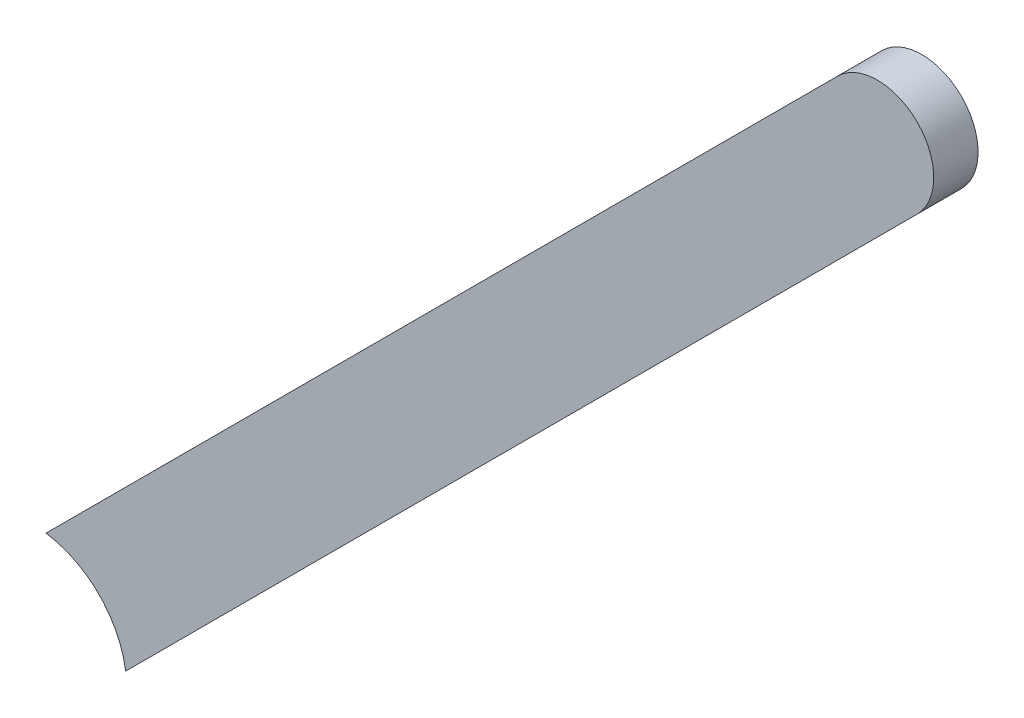
ISO-10303-21;
HEADER;
FILE_DESCRIPTION(('STEP AP214'),'2;1');
FILE_NAME('part.step','',(''),(''),'','','');
FILE_SCHEMA(('AUTOMOTIVE_DESIGN { 1 0 10303 214 1 1 1 1 }'));
ENDSEC;
DATA;
#1=APPLICATION_CONTEXT('core data for automotive mechanical design processes');
#2=APPLICATION_PROTOCOL_DEFINITION('international standard','automotive_design',2000,#1);
#3=PRODUCT_CONTEXT('',#1,'mechanical');
#4=PRODUCT('Part','Part','',(#3));
#5=PRODUCT_RELATED_PRODUCT_CATEGORY('part','',(#4));
#6=PRODUCT_DEFINITION_FORMATION('','',#4);
#7=PRODUCT_DEFINITION_CONTEXT('part definition',#1,'design');
#8=PRODUCT_DEFINITION('design','',#6,#7);
#9=PRODUCT_DEFINITION_SHAPE('','',#8);
#10=(LENGTH_UNIT() NAMED_UNIT(*) SI_UNIT(.MILLI.,.METRE.));
#11=(NAMED_UNIT(*) PLANE_ANGLE_UNIT() SI_UNIT($,.RADIAN.));
#12=(NAMED_UNIT(*) SI_UNIT($,.STERADIAN.) SOLID_ANGLE_UNIT());
#13=UNCERTAINTY_MEASURE_WITH_UNIT(LENGTH_MEASURE(1.E-05),#10,'distance_accuracy_value','');
#14=(GEOMETRIC_REPRESENTATION_CONTEXT(3) GLOBAL_UNCERTAINTY_ASSIGNED_CONTEXT((#13)) GLOBAL_UNIT_ASSIGNED_CONTEXT((#10,
#11,#12)) REPRESENTATION_CONTEXT('',''));
#15=CARTESIAN_POINT('',(0.,0.,0.));
#16=DIRECTION('',(0.,0.,1.));
#17=DIRECTION('',(1.,0.,0.));
#18=AXIS2_PLACEMENT_3D('',#15,#16,#17);
#19=CARTESIAN_POINT('',(140.62855071545,109.28133883545,0.));
#20=DIRECTION('',(-0.707106781186548,0.707106781186548,0.));
#21=DIRECTION('',(0.707106781186548,0.707106781186548,0.));
#22=AXIS2_PLACEMENT_3D('',#19,#20,#21);
#23=PLANE('',#22);
#24=DIRECTION('',(0.707106781186548,0.707106781186548,0.));
#25=VECTOR('',#24,1.);
#26=CARTESIAN_POINT('',(140.38760594,109.04039406,0.1999996));
#27=LINE('',#26,#25);
#28=CARTESIAN_POINT('',(140.62855071545,109.28133883545,0.1999996));
#29=VERTEX_POINT('',#28);
#30=CARTESIAN_POINT('',(144.19760594,112.85039406,0.1999996));
#31=VERTEX_POINT('',#30);
#32=EDGE_CURVE('E11',#29,#31,#27,.T.);
#33=ORIENTED_EDGE('',*,*,#32,.F.);
#34=DIRECTION('',(0.,0.,1.));
#35=VECTOR('',#34,1.);
#36=CARTESIAN_POINT('',(140.62855071545,109.28133883545,0.));
#37=LINE('',#36,#35);
#38=CARTESIAN_POINT('',(140.62855071545,109.28133883545,0.));
#39=VERTEX_POINT('',#38);
#40=EDGE_CURVE('E24',#39,#29,#37,.T.);
#41=ORIENTED_EDGE('',*,*,#40,.F.);
#42=DIRECTION('',(0.707106781186548,0.707106781186548,0.));
#43=VECTOR('',#42,1.);
#44=CARTESIAN_POINT('',(140.38760594,109.04039406,0.));
#45=LINE('',#44,#43);
#46=CARTESIAN_POINT('',(144.19760594,112.85039406,0.));
#47=VERTEX_POINT('',#46);
#48=EDGE_CURVE('E75',#39,#47,#45,.T.);
#49=ORIENTED_EDGE('',*,*,#48,.T.);
#50=DIRECTION('',(0.,0.,1.));
#51=VECTOR('',#50,1.);
#52=CARTESIAN_POINT('',(144.19760594,112.85039406,0.));
#53=LINE('',#52,#51);
#54=EDGE_CURVE('E37',#47,#31,#53,.T.);
#55=ORIENTED_EDGE('',*,*,#54,.T.);
#56=EDGE_LOOP('',(#33,#41,#49,#55));
#57=FACE_BOUND('',#56,.T.);
#58=ADVANCED_FACE('F17',(#57),#23,.F.);
#59=CARTESIAN_POINT('',(144.018,113.03,0.));
#60=DIRECTION('',(0.,0.,-1.));
#61=DIRECTION('',(0.707106781186576,-0.70710678118652,0.));
#62=AXIS2_PLACEMENT_3D('',#59,#60,#61);
#63=CYLINDRICAL_SURFACE('',#62,0.254001156230774);
#64=CARTESIAN_POINT('',(144.018,113.03,0.1999996));
#65=DIRECTION('',(0.,0.,1.));
#66=DIRECTION('',(0.707106781186576,-0.70710678118652,0.));
#67=AXIS2_PLACEMENT_3D('',#64,#65,#66);
#68=CIRCLE('',#67,0.254001156230774);
#69=CARTESIAN_POINT('',(143.83839406,113.20960594,0.1999996));
#70=VERTEX_POINT('',#69);
#71=EDGE_CURVE('E83',#31,#70,#68,.T.);
#72=ORIENTED_EDGE('',*,*,#71,.F.);
#73=ORIENTED_EDGE('',*,*,#54,.F.);
#74=CARTESIAN_POINT('',(144.018,113.03,0.));
#75=DIRECTION('',(0.,0.,1.));
#76=DIRECTION('',(0.707106781186576,-0.70710678118652,0.));
#77=AXIS2_PLACEMENT_3D('',#74,#75,#76);
#78=CIRCLE('',#77,0.254001156230774);
#79=CARTESIAN_POINT('',(143.83839406,113.20960594,0.));
#80=VERTEX_POINT('',#79);
#81=EDGE_CURVE('E81',#47,#80,#78,.T.);
#82=ORIENTED_EDGE('',*,*,#81,.T.);
#83=DIRECTION('',(0.,0.,1.));
#84=VECTOR('',#83,1.);
#85=CARTESIAN_POINT('',(143.83839406,113.20960594,0.));
#86=LINE('',#85,#84);
#87=EDGE_CURVE('E67',#80,#70,#86,.T.);
#88=ORIENTED_EDGE('',*,*,#87,.T.);
#89=EDGE_LOOP('',(#72,#73,#82,#88));
#90=FACE_BOUND('',#89,.T.);
#91=ADVANCED_FACE('F89',(#90),#63,.T.);
#92=CARTESIAN_POINT('',(143.83839406,113.20960594,0.));
#93=DIRECTION('',(0.707106781186548,-0.707106781186548,0.));
#94=DIRECTION('',(-0.707106781186548,-0.707106781186548,0.));
#95=AXIS2_PLACEMENT_3D('',#92,#93,#94);
#96=PLANE('',#95);
#97=DIRECTION('',(-0.707106781186548,-0.707106781186548,0.));
#98=VECTOR('',#97,1.);
#99=CARTESIAN_POINT('',(143.83839406,113.20960594,0.1999996));
#100=LINE('',#99,#98);
#101=CARTESIAN_POINT('',(140.26933883545,109.64055071545,0.1999996));
#102=VERTEX_POINT('',#101);
#103=EDGE_CURVE('E71',#70,#102,#100,.T.);
#104=ORIENTED_EDGE('',*,*,#103,.F.);
#105=ORIENTED_EDGE('',*,*,#87,.F.);
#106=DIRECTION('',(-0.707106781186548,-0.707106781186548,0.));
#107=VECTOR('',#106,1.);
#108=CARTESIAN_POINT('',(143.83839406,113.20960594,0.));
#109=LINE('',#108,#107);
#110=CARTESIAN_POINT('',(140.26933883545,109.64055071545,0.));
#111=VERTEX_POINT('',#110);
#112=EDGE_CURVE('E63',#80,#111,#109,.T.);
#113=ORIENTED_EDGE('',*,*,#112,.T.);
#114=DIRECTION('',(0.,0.,1.));
#115=VECTOR('',#114,1.);
#116=CARTESIAN_POINT('',(140.26933883545,109.64055071545,0.));
#117=LINE('',#116,#115);
#118=EDGE_CURVE('E53',#111,#102,#117,.T.);
#119=ORIENTED_EDGE('',*,*,#118,.T.);
#120=EDGE_LOOP('',(#104,#105,#113,#119));
#121=FACE_BOUND('',#120,.T.);
#122=ADVANCED_FACE('F66',(#121),#96,.F.);
#123=CARTESIAN_POINT('',(140.208,109.22,0.));
#124=DIRECTION('',(0.,0.,-1.));
#125=DIRECTION('',(1.,0.,0.));
#126=AXIS2_PLACEMENT_3D('',#123,#124,#125);
#127=CYLINDRICAL_SURFACE('',#126,0.42500042);
#128=ORIENTED_EDGE('',*,*,#40,.T.);
#129=CARTESIAN_POINT('',(140.208,109.22,0.1999996));
#130=DIRECTION('',(0.,0.,1.));
#131=DIRECTION('',(1.,0.,0.));
#132=AXIS2_PLACEMENT_3D('',#129,#130,#131);
#133=CIRCLE('',#132,0.42500042);
#134=EDGE_CURVE('E59',#29,#102,#133,.T.);
#135=ORIENTED_EDGE('',*,*,#134,.T.);
#136=ORIENTED_EDGE('',*,*,#118,.F.);
#137=CARTESIAN_POINT('',(140.208,109.22,0.));
#138=DIRECTION('',(0.,0.,1.));
#139=DIRECTION('',(1.,0.,0.));
#140=AXIS2_PLACEMENT_3D('',#137,#138,#139);
#141=CIRCLE('',#140,0.42500042);
#142=EDGE_CURVE('E57',#39,#111,#141,.T.);
#143=ORIENTED_EDGE('',*,*,#142,.F.);
#144=EDGE_LOOP('',(#128,#135,#136,#143));
#145=FACE_BOUND('',#144,.T.);
#146=ADVANCED_FACE('F55',(#145),#127,.F.);
#147=CARTESIAN_POINT('',(140.38760594,109.04039406,0.));
#148=DIRECTION('',(0.,0.,-1.));
#149=DIRECTION('',(-1.,0.,0.));
#150=AXIS2_PLACEMENT_3D('',#147,#148,#149);
#151=PLANE('',#150);
#152=ORIENTED_EDGE('',*,*,#48,.F.);
#153=ORIENTED_EDGE('',*,*,#142,.T.);
#154=ORIENTED_EDGE('',*,*,#112,.F.);
#155=ORIENTED_EDGE('',*,*,#81,.F.);
#156=EDGE_LOOP('',(#152,#153,#154,#155));
#157=FACE_BOUND('',#156,.T.);
#158=ADVANCED_FACE('F74',(#157),#151,.T.);
#159=CARTESIAN_POINT('',(140.38760594,109.04039406,0.1999996));
#160=DIRECTION('',(0.,0.,-1.));
#161=DIRECTION('',(-1.,0.,0.));
#162=AXIS2_PLACEMENT_3D('',#159,#160,#161);
#163=PLANE('',#162);
#164=ORIENTED_EDGE('',*,*,#134,.F.);
#165=ORIENTED_EDGE('',*,*,#32,.T.);
#166=ORIENTED_EDGE('',*,*,#71,.T.);
#167=ORIENTED_EDGE('',*,*,#103,.T.);
#168=EDGE_LOOP('',(#164,#165,#166,#167));
#169=FACE_BOUND('',#168,.T.);
#170=ADVANCED_FACE('F91',(#169),#163,.F.);
#171=CLOSED_SHELL('',(#58,#91,#122,#146,#158,#170));
#172=MANIFOLD_SOLID_BREP('B1',#171);
#173=ADVANCED_BREP_SHAPE_REPRESENTATION('',(#18,#172),#14);
#174=SHAPE_DEFINITION_REPRESENTATION(#9,#173);
ENDSEC;
END-ISO-10303-21;
